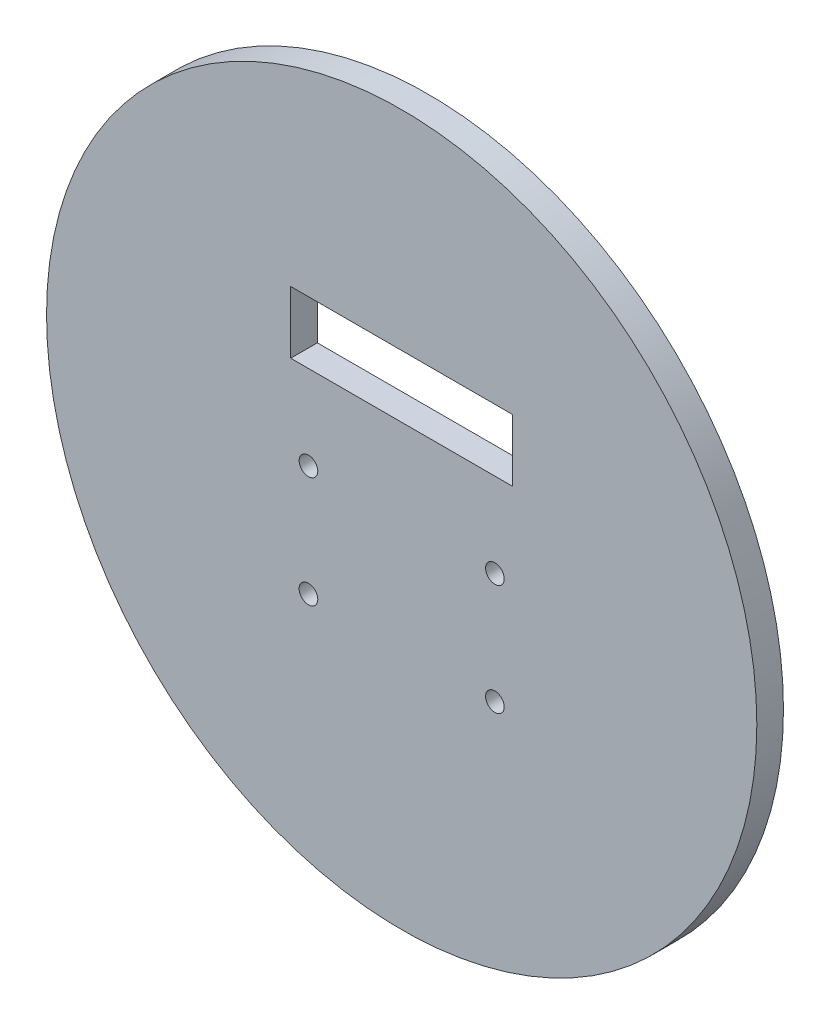
ISO-10303-21;
HEADER;
FILE_DESCRIPTION(('STEP AP214'),'2;1');
FILE_NAME('part.step','',(''),(''),'','','');
FILE_SCHEMA(('AUTOMOTIVE_DESIGN { 1 0 10303 214 1 1 1 1 }'));
ENDSEC;
DATA;
#1=APPLICATION_CONTEXT('core data for automotive mechanical design processes');
#2=APPLICATION_PROTOCOL_DEFINITION('international standard','automotive_design',2000,#1);
#3=PRODUCT_CONTEXT('',#1,'mechanical');
#4=PRODUCT('Part','Part','',(#3));
#5=PRODUCT_RELATED_PRODUCT_CATEGORY('part','',(#4));
#6=PRODUCT_DEFINITION_FORMATION('','',#4);
#7=PRODUCT_DEFINITION_CONTEXT('part definition',#1,'design');
#8=PRODUCT_DEFINITION('design','',#6,#7);
#9=PRODUCT_DEFINITION_SHAPE('','',#8);
#10=(LENGTH_UNIT() NAMED_UNIT(*) SI_UNIT(.MILLI.,.METRE.));
#11=(NAMED_UNIT(*) PLANE_ANGLE_UNIT() SI_UNIT($,.RADIAN.));
#12=(NAMED_UNIT(*) SI_UNIT($,.STERADIAN.) SOLID_ANGLE_UNIT());
#13=UNCERTAINTY_MEASURE_WITH_UNIT(LENGTH_MEASURE(1.E-05),#10,'distance_accuracy_value','');
#14=(GEOMETRIC_REPRESENTATION_CONTEXT(3) GLOBAL_UNCERTAINTY_ASSIGNED_CONTEXT((#13)) GLOBAL_UNIT_ASSIGNED_CONTEXT((#10,
#11,#12)) REPRESENTATION_CONTEXT('',''));
#15=CARTESIAN_POINT('',(0.,0.,0.));
#16=DIRECTION('',(0.,0.,1.));
#17=DIRECTION('',(1.,0.,0.));
#18=AXIS2_PLACEMENT_3D('',#15,#16,#17);
#19=CARTESIAN_POINT('',(0.,0.,0.));
#20=DIRECTION('',(0.,0.,1.));
#21=DIRECTION('',(1.,0.,0.));
#22=AXIS2_PLACEMENT_3D('',#19,#20,#21);
#23=PLANE('',#22);
#24=DIRECTION('',(0.,1.,0.));
#25=VECTOR('',#24,1.);
#26=CARTESIAN_POINT('',(-12.5,0.,0.));
#27=LINE('',#26,#25);
#28=CARTESIAN_POINT('',(-12.5,9.49999999999999,0.));
#29=VERTEX_POINT('',#28);
#30=CARTESIAN_POINT('',(-12.5,16.5,0.));
#31=VERTEX_POINT('',#30);
#32=EDGE_CURVE('E163',#29,#31,#27,.T.);
#33=ORIENTED_EDGE('',*,*,#32,.F.);
#34=DIRECTION('',(-1.,0.,0.));
#35=VECTOR('',#34,1.);
#36=CARTESIAN_POINT('',(0.,9.5,0.));
#37=LINE('',#36,#35);
#38=CARTESIAN_POINT('',(12.5,9.5,0.));
#39=VERTEX_POINT('',#38);
#40=EDGE_CURVE('E155',#39,#29,#37,.T.);
#41=ORIENTED_EDGE('',*,*,#40,.F.);
#42=DIRECTION('',(0.,1.,0.));
#43=VECTOR('',#42,1.);
#44=CARTESIAN_POINT('',(12.5,0.,0.));
#45=LINE('',#44,#43);
#46=CARTESIAN_POINT('',(12.5,16.5,0.));
#47=VERTEX_POINT('',#46);
#48=EDGE_CURVE('E166',#39,#47,#45,.T.);
#49=ORIENTED_EDGE('',*,*,#48,.T.);
#50=DIRECTION('',(-1.,0.,0.));
#51=VECTOR('',#50,1.);
#52=CARTESIAN_POINT('',(0.,16.5,0.));
#53=LINE('',#52,#51);
#54=EDGE_CURVE('E170',#47,#31,#53,.T.);
#55=ORIENTED_EDGE('',*,*,#54,.T.);
#56=EDGE_LOOP('',(#33,#41,#49,#55));
#57=FACE_BOUND('',#56,.T.);
#58=CARTESIAN_POINT('',(0.,0.,0.));
#59=DIRECTION('',(0.,0.,1.));
#60=DIRECTION('',(1.,0.,0.));
#61=AXIS2_PLACEMENT_3D('',#58,#59,#60);
#62=CIRCLE('',#61,40.);
#63=CARTESIAN_POINT('',(40.,0.,0.));
#64=VERTEX_POINT('',#63);
#65=EDGE_CURVE('E45',#64,#64,#62,.T.);
#66=ORIENTED_EDGE('',*,*,#65,.F.);
#67=EDGE_LOOP('',(#66));
#68=FACE_BOUND('',#67,.T.);
#69=DIRECTION('',(0.,-1.,0.));
#70=VECTOR('',#69,1.);
#71=CARTESIAN_POINT('',(12.5,0.,0.));
#72=LINE('',#71,#70);
#73=CARTESIAN_POINT('',(12.5,4.,0.));
#74=VERTEX_POINT('',#73);
#75=CARTESIAN_POINT('',(12.5,-14.5,0.));
#76=VERTEX_POINT('',#75);
#77=EDGE_CURVE('E142',#74,#76,#72,.T.);
#78=ORIENTED_EDGE('',*,*,#77,.F.);
#79=DIRECTION('',(-1.,0.,0.));
#80=VECTOR('',#79,1.);
#81=CARTESIAN_POINT('',(0.,4.,0.));
#82=LINE('',#81,#80);
#83=CARTESIAN_POINT('',(-12.5,3.99999999999999,0.));
#84=VERTEX_POINT('',#83);
#85=EDGE_CURVE('E113',#74,#84,#82,.T.);
#86=ORIENTED_EDGE('',*,*,#85,.T.);
#87=DIRECTION('',(0.,-1.,0.));
#88=VECTOR('',#87,1.);
#89=CARTESIAN_POINT('',(-12.5,0.,0.));
#90=LINE('',#89,#88);
#91=CARTESIAN_POINT('',(-12.5,-14.5,0.));
#92=VERTEX_POINT('',#91);
#93=EDGE_CURVE('E57',#84,#92,#90,.T.);
#94=ORIENTED_EDGE('',*,*,#93,.T.);
#95=DIRECTION('',(-1.,0.,0.));
#96=VECTOR('',#95,1.);
#97=CARTESIAN_POINT('',(0.,-14.5,0.));
#98=LINE('',#97,#96);
#99=EDGE_CURVE('E128',#76,#92,#98,.T.);
#100=ORIENTED_EDGE('',*,*,#99,.F.);
#101=EDGE_LOOP('',(#78,#86,#94,#100));
#102=FACE_BOUND('',#101,.T.);
#103=ADVANCED_FACE('F41',(#57,#68,#102),#23,.F.);
#104=CARTESIAN_POINT('',(0.,0.,3.));
#105=DIRECTION('',(0.,0.,1.));
#106=DIRECTION('',(1.,0.,0.));
#107=AXIS2_PLACEMENT_3D('',#104,#105,#106);
#108=PLANE('',#107);
#109=DIRECTION('',(0.,-1.,0.));
#110=VECTOR('',#109,1.);
#111=CARTESIAN_POINT('',(-12.5,0.,3.));
#112=LINE('',#111,#110);
#113=CARTESIAN_POINT('',(-12.5,16.5,3.));
#114=VERTEX_POINT('',#113);
#115=CARTESIAN_POINT('',(-12.5,9.49999999999999,3.));
#116=VERTEX_POINT('',#115);
#117=EDGE_CURVE('E199',#114,#116,#112,.T.);
#118=ORIENTED_EDGE('',*,*,#117,.F.);
#119=DIRECTION('',(1.,0.,0.));
#120=VECTOR('',#119,1.);
#121=CARTESIAN_POINT('',(0.,16.5,3.));
#122=LINE('',#121,#120);
#123=CARTESIAN_POINT('',(12.5,16.5,3.));
#124=VERTEX_POINT('',#123);
#125=EDGE_CURVE('E188',#114,#124,#122,.T.);
#126=ORIENTED_EDGE('',*,*,#125,.T.);
#127=DIRECTION('',(0.,-1.,0.));
#128=VECTOR('',#127,1.);
#129=CARTESIAN_POINT('',(12.5,0.,3.));
#130=LINE('',#129,#128);
#131=CARTESIAN_POINT('',(12.5,9.5,3.));
#132=VERTEX_POINT('',#131);
#133=EDGE_CURVE('E192',#124,#132,#130,.T.);
#134=ORIENTED_EDGE('',*,*,#133,.T.);
#135=DIRECTION('',(1.,0.,0.));
#136=VECTOR('',#135,1.);
#137=CARTESIAN_POINT('',(0.,9.5,3.));
#138=LINE('',#137,#136);
#139=EDGE_CURVE('E196',#116,#132,#138,.T.);
#140=ORIENTED_EDGE('',*,*,#139,.F.);
#141=EDGE_LOOP('',(#118,#126,#134,#140));
#142=FACE_BOUND('',#141,.T.);
#143=CARTESIAN_POINT('',(-10.5,0.,3.));
#144=DIRECTION('',(0.,0.,1.));
#145=DIRECTION('',(1.,0.,0.));
#146=AXIS2_PLACEMENT_3D('',#143,#144,#145);
#147=CIRCLE('',#146,1.05);
#148=CARTESIAN_POINT('',(-9.45,0.,3.));
#149=VERTEX_POINT('',#148);
#150=EDGE_CURVE('E206',#149,#149,#147,.T.);
#151=ORIENTED_EDGE('',*,*,#150,.F.);
#152=EDGE_LOOP('',(#151));
#153=FACE_BOUND('',#152,.T.);
#154=CARTESIAN_POINT('',(-10.5,-12.5,3.));
#155=DIRECTION('',(0.,0.,1.));
#156=DIRECTION('',(1.,0.,0.));
#157=AXIS2_PLACEMENT_3D('',#154,#155,#156);
#158=CIRCLE('',#157,1.05);
#159=CARTESIAN_POINT('',(-9.45,-12.5,3.));
#160=VERTEX_POINT('',#159);
#161=EDGE_CURVE('E214',#160,#160,#158,.T.);
#162=ORIENTED_EDGE('',*,*,#161,.F.);
#163=EDGE_LOOP('',(#162));
#164=FACE_BOUND('',#163,.T.);
#165=CARTESIAN_POINT('',(0.,0.,3.));
#166=DIRECTION('',(0.,0.,1.));
#167=DIRECTION('',(1.,0.,0.));
#168=AXIS2_PLACEMENT_3D('',#165,#166,#167);
#169=CIRCLE('',#168,40.);
#170=CARTESIAN_POINT('',(40.,0.,3.));
#171=VERTEX_POINT('',#170);
#172=EDGE_CURVE('E11',#171,#171,#169,.T.);
#173=ORIENTED_EDGE('',*,*,#172,.T.);
#174=EDGE_LOOP('',(#173));
#175=FACE_BOUND('',#174,.T.);
#176=CARTESIAN_POINT('',(10.5,-12.5,3.));
#177=DIRECTION('',(0.,0.,1.));
#178=DIRECTION('',(1.,0.,0.));
#179=AXIS2_PLACEMENT_3D('',#176,#177,#178);
#180=CIRCLE('',#179,1.05);
#181=CARTESIAN_POINT('',(11.55,-12.5,3.));
#182=VERTEX_POINT('',#181);
#183=EDGE_CURVE('E210',#182,#182,#180,.T.);
#184=ORIENTED_EDGE('',*,*,#183,.F.);
#185=EDGE_LOOP('',(#184));
#186=FACE_BOUND('',#185,.T.);
#187=CARTESIAN_POINT('',(10.5,0.,3.));
#188=DIRECTION('',(0.,0.,1.));
#189=DIRECTION('',(1.,0.,0.));
#190=AXIS2_PLACEMENT_3D('',#187,#188,#189);
#191=CIRCLE('',#190,1.05);
#192=CARTESIAN_POINT('',(11.55,0.,3.));
#193=VERTEX_POINT('',#192);
#194=EDGE_CURVE('E202',#193,#193,#191,.T.);
#195=ORIENTED_EDGE('',*,*,#194,.F.);
#196=EDGE_LOOP('',(#195));
#197=FACE_BOUND('',#196,.T.);
#198=ADVANCED_FACE('F226',(#142,#153,#164,#175,#186,#197),#108,.T.);
#199=CARTESIAN_POINT('',(0.,0.,3.));
#200=DIRECTION('',(0.,0.,-1.));
#201=DIRECTION('',(-1.,0.,0.));
#202=AXIS2_PLACEMENT_3D('',#199,#200,#201);
#203=CYLINDRICAL_SURFACE('',#202,40.);
#204=ORIENTED_EDGE('',*,*,#172,.F.);
#205=EDGE_LOOP('',(#204));
#206=FACE_BOUND('',#205,.T.);
#207=ORIENTED_EDGE('',*,*,#65,.T.);
#208=EDGE_LOOP('',(#207));
#209=FACE_BOUND('',#208,.T.);
#210=ADVANCED_FACE('F43',(#206,#209),#203,.T.);
#211=CARTESIAN_POINT('',(-10.5,-12.5,3.));
#212=DIRECTION('',(0.,0.,-1.));
#213=DIRECTION('',(-1.,0.,0.));
#214=AXIS2_PLACEMENT_3D('',#211,#212,#213);
#215=CYLINDRICAL_SURFACE('',#214,1.05);
#216=ORIENTED_EDGE('',*,*,#161,.T.);
#217=EDGE_LOOP('',(#216));
#218=FACE_BOUND('',#217,.T.);
#219=CARTESIAN_POINT('',(-10.5,-12.5,-1.99999999999999));
#220=DIRECTION('',(0.,0.,1.));
#221=DIRECTION('',(1.,0.,0.));
#222=AXIS2_PLACEMENT_3D('',#219,#220,#221);
#223=CIRCLE('',#222,1.05);
#224=CARTESIAN_POINT('',(-9.45,-12.5,-1.99999999999999));
#225=VERTEX_POINT('',#224);
#226=EDGE_CURVE('E298',#225,#225,#223,.T.);
#227=ORIENTED_EDGE('',*,*,#226,.F.);
#228=EDGE_LOOP('',(#227));
#229=FACE_BOUND('',#228,.T.);
#230=ADVANCED_FACE('F271',(#218,#229),#215,.F.);
#231=CARTESIAN_POINT('',(10.5,-12.5,3.));
#232=DIRECTION('',(0.,0.,-1.));
#233=DIRECTION('',(-1.,0.,0.));
#234=AXIS2_PLACEMENT_3D('',#231,#232,#233);
#235=CYLINDRICAL_SURFACE('',#234,1.05);
#236=ORIENTED_EDGE('',*,*,#183,.T.);
#237=EDGE_LOOP('',(#236));
#238=FACE_BOUND('',#237,.T.);
#239=CARTESIAN_POINT('',(10.5,-12.5,-1.99999999999999));
#240=DIRECTION('',(0.,0.,1.));
#241=DIRECTION('',(1.,0.,0.));
#242=AXIS2_PLACEMENT_3D('',#239,#240,#241);
#243=CIRCLE('',#242,1.05);
#244=CARTESIAN_POINT('',(11.55,-12.5,-1.99999999999999));
#245=VERTEX_POINT('',#244);
#246=EDGE_CURVE('E299',#245,#245,#243,.T.);
#247=ORIENTED_EDGE('',*,*,#246,.F.);
#248=EDGE_LOOP('',(#247));
#249=FACE_BOUND('',#248,.T.);
#250=ADVANCED_FACE('F267',(#238,#249),#235,.F.);
#251=CARTESIAN_POINT('',(-10.5,0.,3.));
#252=DIRECTION('',(0.,0.,-1.));
#253=DIRECTION('',(-1.,0.,0.));
#254=AXIS2_PLACEMENT_3D('',#251,#252,#253);
#255=CYLINDRICAL_SURFACE('',#254,1.05);
#256=ORIENTED_EDGE('',*,*,#150,.T.);
#257=EDGE_LOOP('',(#256));
#258=FACE_BOUND('',#257,.T.);
#259=CARTESIAN_POINT('',(-10.5,0.,-1.99999999999999));
#260=DIRECTION('',(0.,0.,1.));
#261=DIRECTION('',(1.,0.,0.));
#262=AXIS2_PLACEMENT_3D('',#259,#260,#261);
#263=CIRCLE('',#262,1.05);
#264=CARTESIAN_POINT('',(-9.45,0.,-1.99999999999999));
#265=VERTEX_POINT('',#264);
#266=EDGE_CURVE('E145',#265,#265,#263,.T.);
#267=ORIENTED_EDGE('',*,*,#266,.F.);
#268=EDGE_LOOP('',(#267));
#269=FACE_BOUND('',#268,.T.);
#270=ADVANCED_FACE('F263',(#258,#269),#255,.F.);
#271=CARTESIAN_POINT('',(10.5,0.,3.));
#272=DIRECTION('',(0.,0.,-1.));
#273=DIRECTION('',(-1.,0.,0.));
#274=AXIS2_PLACEMENT_3D('',#271,#272,#273);
#275=CYLINDRICAL_SURFACE('',#274,1.05);
#276=ORIENTED_EDGE('',*,*,#194,.T.);
#277=EDGE_LOOP('',(#276));
#278=FACE_BOUND('',#277,.T.);
#279=CARTESIAN_POINT('',(10.5,0.,-1.99999999999999));
#280=DIRECTION('',(0.,0.,1.));
#281=DIRECTION('',(1.,0.,0.));
#282=AXIS2_PLACEMENT_3D('',#279,#280,#281);
#283=CIRCLE('',#282,1.05);
#284=CARTESIAN_POINT('',(11.55,0.,-1.99999999999999));
#285=VERTEX_POINT('',#284);
#286=EDGE_CURVE('E295',#285,#285,#283,.T.);
#287=ORIENTED_EDGE('',*,*,#286,.F.);
#288=EDGE_LOOP('',(#287));
#289=FACE_BOUND('',#288,.T.);
#290=ADVANCED_FACE('F259',(#278,#289),#275,.F.);
#291=CARTESIAN_POINT('',(-12.5,0.,14.));
#292=DIRECTION('',(-1.,0.,0.));
#293=DIRECTION('',(0.,0.,1.));
#294=AXIS2_PLACEMENT_3D('',#291,#292,#293);
#295=PLANE('',#294);
#296=ORIENTED_EDGE('',*,*,#117,.T.);
#297=DIRECTION('',(0.,0.,-1.));
#298=VECTOR('',#297,1.);
#299=CARTESIAN_POINT('',(-12.5,9.49999999999999,14.));
#300=LINE('',#299,#298);
#301=EDGE_CURVE('E184',#116,#29,#300,.T.);
#302=ORIENTED_EDGE('',*,*,#301,.T.);
#303=ORIENTED_EDGE('',*,*,#32,.T.);
#304=DIRECTION('',(0.,0.,-1.));
#305=VECTOR('',#304,1.);
#306=CARTESIAN_POINT('',(-12.5,16.5,14.));
#307=LINE('',#306,#305);
#308=EDGE_CURVE('E174',#114,#31,#307,.T.);
#309=ORIENTED_EDGE('',*,*,#308,.F.);
#310=EDGE_LOOP('',(#296,#302,#303,#309));
#311=FACE_BOUND('',#310,.T.);
#312=ADVANCED_FACE('F255',(#311),#295,.F.);
#313=CARTESIAN_POINT('',(0.,9.5,14.));
#314=DIRECTION('',(0.,-1.,0.));
#315=DIRECTION('',(1.,0.,0.));
#316=AXIS2_PLACEMENT_3D('',#313,#314,#315);
#317=PLANE('',#316);
#318=DIRECTION('',(0.,0.,-1.));
#319=VECTOR('',#318,1.);
#320=CARTESIAN_POINT('',(12.5,9.5,14.));
#321=LINE('',#320,#319);
#322=EDGE_CURVE('E180',#132,#39,#321,.T.);
#323=ORIENTED_EDGE('',*,*,#322,.T.);
#324=ORIENTED_EDGE('',*,*,#40,.T.);
#325=ORIENTED_EDGE('',*,*,#301,.F.);
#326=ORIENTED_EDGE('',*,*,#139,.T.);
#327=EDGE_LOOP('',(#323,#324,#325,#326));
#328=FACE_BOUND('',#327,.T.);
#329=ADVANCED_FACE('F251',(#328),#317,.F.);
#330=CARTESIAN_POINT('',(12.5,0.,14.));
#331=DIRECTION('',(-1.,0.,0.));
#332=DIRECTION('',(0.,0.,1.));
#333=AXIS2_PLACEMENT_3D('',#330,#331,#332);
#334=PLANE('',#333);
#335=DIRECTION('',(0.,0.,-1.));
#336=VECTOR('',#335,1.);
#337=CARTESIAN_POINT('',(12.5,16.5,14.));
#338=LINE('',#337,#336);
#339=EDGE_CURVE('E65',#124,#47,#338,.T.);
#340=ORIENTED_EDGE('',*,*,#339,.T.);
#341=ORIENTED_EDGE('',*,*,#48,.F.);
#342=ORIENTED_EDGE('',*,*,#322,.F.);
#343=ORIENTED_EDGE('',*,*,#133,.F.);
#344=EDGE_LOOP('',(#340,#341,#342,#343));
#345=FACE_BOUND('',#344,.T.);
#346=ADVANCED_FACE('F248',(#345),#334,.T.);
#347=CARTESIAN_POINT('',(0.,16.5,14.));
#348=DIRECTION('',(0.,-1.,0.));
#349=DIRECTION('',(1.,0.,0.));
#350=AXIS2_PLACEMENT_3D('',#347,#348,#349);
#351=PLANE('',#350);
#352=ORIENTED_EDGE('',*,*,#308,.T.);
#353=ORIENTED_EDGE('',*,*,#54,.F.);
#354=ORIENTED_EDGE('',*,*,#339,.F.);
#355=ORIENTED_EDGE('',*,*,#125,.F.);
#356=EDGE_LOOP('',(#352,#353,#354,#355));
#357=FACE_BOUND('',#356,.T.);
#358=ADVANCED_FACE('F245',(#357),#351,.T.);
#359=CARTESIAN_POINT('',(12.5,0.,-1.99999999999999));
#360=DIRECTION('',(-1.,0.,0.));
#361=DIRECTION('',(0.,-1.,0.));
#362=AXIS2_PLACEMENT_3D('',#359,#360,#361);
#363=PLANE('',#362);
#364=ORIENTED_EDGE('',*,*,#77,.T.);
#365=DIRECTION('',(0.,0.,1.));
#366=VECTOR('',#365,1.);
#367=CARTESIAN_POINT('',(12.5,-14.5,-1.99999999999999));
#368=LINE('',#367,#366);
#369=CARTESIAN_POINT('',(12.5,-14.5,-1.99999999999999));
#370=VERTEX_POINT('',#369);
#371=EDGE_CURVE('E125',#370,#76,#368,.T.);
#372=ORIENTED_EDGE('',*,*,#371,.F.);
#373=DIRECTION('',(0.,-1.,0.));
#374=VECTOR('',#373,1.);
#375=CARTESIAN_POINT('',(12.5,0.,-1.99999999999999));
#376=LINE('',#375,#374);
#377=CARTESIAN_POINT('',(12.5,4.,-1.99999999999999));
#378=VERTEX_POINT('',#377);
#379=EDGE_CURVE('E123',#378,#370,#376,.T.);
#380=ORIENTED_EDGE('',*,*,#379,.F.);
#381=DIRECTION('',(0.,0.,1.));
#382=VECTOR('',#381,1.);
#383=CARTESIAN_POINT('',(12.5,4.,-1.99999999999999));
#384=LINE('',#383,#382);
#385=EDGE_CURVE('E107',#378,#74,#384,.T.);
#386=ORIENTED_EDGE('',*,*,#385,.T.);
#387=EDGE_LOOP('',(#364,#372,#380,#386));
#388=FACE_BOUND('',#387,.T.);
#389=ADVANCED_FACE('F124',(#388),#363,.F.);
#390=CARTESIAN_POINT('',(0.,-14.5,-1.99999999999999));
#391=DIRECTION('',(0.,1.,0.));
#392=DIRECTION('',(-1.,0.,0.));
#393=AXIS2_PLACEMENT_3D('',#390,#391,#392);
#394=PLANE('',#393);
#395=ORIENTED_EDGE('',*,*,#99,.T.);
#396=DIRECTION('',(0.,0.,1.));
#397=VECTOR('',#396,1.);
#398=CARTESIAN_POINT('',(-12.5,-14.5,-1.99999999999999));
#399=LINE('',#398,#397);
#400=CARTESIAN_POINT('',(-12.5,-14.5,-1.99999999999999));
#401=VERTEX_POINT('',#400);
#402=EDGE_CURVE('E156',#401,#92,#399,.T.);
#403=ORIENTED_EDGE('',*,*,#402,.F.);
#404=DIRECTION('',(-1.,0.,0.));
#405=VECTOR('',#404,1.);
#406=CARTESIAN_POINT('',(0.,-14.5,-1.99999999999999));
#407=LINE('',#406,#405);
#408=EDGE_CURVE('E119',#370,#401,#407,.T.);
#409=ORIENTED_EDGE('',*,*,#408,.F.);
#410=ORIENTED_EDGE('',*,*,#371,.T.);
#411=EDGE_LOOP('',(#395,#403,#409,#410));
#412=FACE_BOUND('',#411,.T.);
#413=ADVANCED_FACE('F231',(#412),#394,.F.);
#414=CARTESIAN_POINT('',(-12.5,0.,-1.99999999999999));
#415=DIRECTION('',(-1.,0.,0.));
#416=DIRECTION('',(0.,-1.,0.));
#417=AXIS2_PLACEMENT_3D('',#414,#415,#416);
#418=PLANE('',#417);
#419=ORIENTED_EDGE('',*,*,#93,.F.);
#420=DIRECTION('',(0.,0.,1.));
#421=VECTOR('',#420,1.);
#422=CARTESIAN_POINT('',(-12.5,3.99999999999999,-1.99999999999999));
#423=LINE('',#422,#421);
#424=CARTESIAN_POINT('',(-12.5,3.99999999999999,-1.99999999999999));
#425=VERTEX_POINT('',#424);
#426=EDGE_CURVE('E118',#425,#84,#423,.T.);
#427=ORIENTED_EDGE('',*,*,#426,.F.);
#428=DIRECTION('',(0.,-1.,0.));
#429=VECTOR('',#428,1.);
#430=CARTESIAN_POINT('',(-12.5,0.,-1.99999999999999));
#431=LINE('',#430,#429);
#432=EDGE_CURVE('E133',#425,#401,#431,.T.);
#433=ORIENTED_EDGE('',*,*,#432,.T.);
#434=ORIENTED_EDGE('',*,*,#402,.T.);
#435=EDGE_LOOP('',(#419,#427,#433,#434));
#436=FACE_BOUND('',#435,.T.);
#437=ADVANCED_FACE('F232',(#436),#418,.T.);
#438=CARTESIAN_POINT('',(0.,4.,-1.99999999999999));
#439=DIRECTION('',(0.,1.,0.));
#440=DIRECTION('',(-1.,0.,0.));
#441=AXIS2_PLACEMENT_3D('',#438,#439,#440);
#442=PLANE('',#441);
#443=ORIENTED_EDGE('',*,*,#85,.F.);
#444=ORIENTED_EDGE('',*,*,#385,.F.);
#445=DIRECTION('',(-1.,0.,0.));
#446=VECTOR('',#445,1.);
#447=CARTESIAN_POINT('',(0.,4.,-1.99999999999999));
#448=LINE('',#447,#446);
#449=EDGE_CURVE('E111',#378,#425,#448,.T.);
#450=ORIENTED_EDGE('',*,*,#449,.T.);
#451=ORIENTED_EDGE('',*,*,#426,.T.);
#452=EDGE_LOOP('',(#443,#444,#450,#451));
#453=FACE_BOUND('',#452,.T.);
#454=ADVANCED_FACE('F109',(#453),#442,.T.);
#455=CARTESIAN_POINT('',(0.,0.,-1.99999999999999));
#456=DIRECTION('',(0.,0.,1.));
#457=DIRECTION('',(1.,0.,0.));
#458=AXIS2_PLACEMENT_3D('',#455,#456,#457);
#459=PLANE('',#458);
#460=ORIENTED_EDGE('',*,*,#226,.T.);
#461=EDGE_LOOP('',(#460));
#462=FACE_BOUND('',#461,.T.);
#463=ORIENTED_EDGE('',*,*,#286,.T.);
#464=EDGE_LOOP('',(#463));
#465=FACE_BOUND('',#464,.T.);
#466=ORIENTED_EDGE('',*,*,#246,.T.);
#467=EDGE_LOOP('',(#466));
#468=FACE_BOUND('',#467,.T.);
#469=ORIENTED_EDGE('',*,*,#266,.T.);
#470=EDGE_LOOP('',(#469));
#471=FACE_BOUND('',#470,.T.);
#472=ORIENTED_EDGE('',*,*,#379,.T.);
#473=ORIENTED_EDGE('',*,*,#408,.T.);
#474=ORIENTED_EDGE('',*,*,#432,.F.);
#475=ORIENTED_EDGE('',*,*,#449,.F.);
#476=EDGE_LOOP('',(#472,#473,#474,#475));
#477=FACE_BOUND('',#476,.T.);
#478=ADVANCED_FACE('F131',(#462,#465,#468,#471,#477),#459,.F.);
#479=CLOSED_SHELL('',(#103,#198,#210,#230,#250,#270,#290,#312,#329,#346,#358,#389,#413,#437,
#454,#478));
#480=MANIFOLD_SOLID_BREP('B2',#479);
#481=ADVANCED_BREP_SHAPE_REPRESENTATION('',(#18,#480),#14);
#482=SHAPE_DEFINITION_REPRESENTATION(#9,#481);
ENDSEC;
END-ISO-10303-21;
